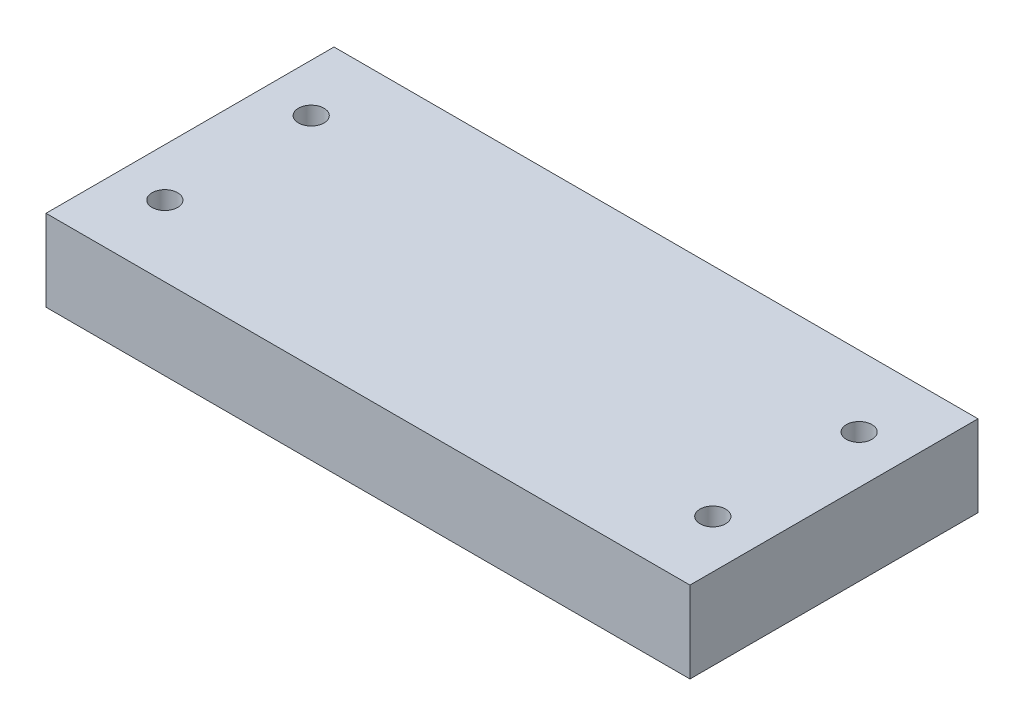
ISO-10303-21;
HEADER;
FILE_DESCRIPTION(('STEP AP214'),'2;1');
FILE_NAME('part.step','',(''),(''),'','','');
FILE_SCHEMA(('AUTOMOTIVE_DESIGN { 1 0 10303 214 1 1 1 1 }'));
ENDSEC;
DATA;
#1=APPLICATION_CONTEXT('core data for automotive mechanical design processes');
#2=APPLICATION_PROTOCOL_DEFINITION('international standard','automotive_design',2000,#1);
#3=PRODUCT_CONTEXT('',#1,'mechanical');
#4=PRODUCT('Part','Part','',(#3));
#5=PRODUCT_RELATED_PRODUCT_CATEGORY('part','',(#4));
#6=PRODUCT_DEFINITION_FORMATION('','',#4);
#7=PRODUCT_DEFINITION_CONTEXT('part definition',#1,'design');
#8=PRODUCT_DEFINITION('design','',#6,#7);
#9=PRODUCT_DEFINITION_SHAPE('','',#8);
#10=(LENGTH_UNIT() NAMED_UNIT(*) SI_UNIT(.MILLI.,.METRE.));
#11=(NAMED_UNIT(*) PLANE_ANGLE_UNIT() SI_UNIT($,.RADIAN.));
#12=(NAMED_UNIT(*) SI_UNIT($,.STERADIAN.) SOLID_ANGLE_UNIT());
#13=UNCERTAINTY_MEASURE_WITH_UNIT(LENGTH_MEASURE(1.E-05),#10,'distance_accuracy_value','');
#14=(GEOMETRIC_REPRESENTATION_CONTEXT(3) GLOBAL_UNCERTAINTY_ASSIGNED_CONTEXT((#13)) GLOBAL_UNIT_ASSIGNED_CONTEXT((#10,
#11,#12)) REPRESENTATION_CONTEXT('',''));
#15=CARTESIAN_POINT('',(0.,0.,0.));
#16=DIRECTION('',(0.,0.,1.));
#17=DIRECTION('',(1.,0.,0.));
#18=AXIS2_PLACEMENT_3D('',#15,#16,#17);
#19=CARTESIAN_POINT('',(59.436,0.,-15.875));
#20=DIRECTION('',(0.,1.,0.));
#21=DIRECTION('',(0.,0.,1.));
#22=AXIS2_PLACEMENT_3D('',#19,#20,#21);
#23=CYLINDRICAL_SURFACE('',#22,2.778125);
#24=CARTESIAN_POINT('',(59.436,0.,-15.875));
#25=DIRECTION('',(0.,1.,0.));
#26=DIRECTION('',(0.,0.,1.));
#27=AXIS2_PLACEMENT_3D('',#24,#25,#26);
#28=CIRCLE('',#27,2.778125);
#29=CARTESIAN_POINT('',(59.436,0.,-13.096875));
#30=VERTEX_POINT('',#29);
#31=EDGE_CURVE('E50',#30,#30,#28,.T.);
#32=CARTESIAN_POINT('',(59.436,17.653,-15.875));
#33=DIRECTION('',(0.,1.,0.));
#34=DIRECTION('',(0.,0.,1.));
#35=AXIS2_PLACEMENT_3D('',#32,#33,#34);
#36=CIRCLE('',#35,2.778125);
#37=CARTESIAN_POINT('',(59.436,17.653,-13.096875));
#38=VERTEX_POINT('',#37);
#39=EDGE_CURVE('E11',#38,#38,#36,.T.);
#40=CARTESIAN_POINT('',(59.436,0.,-13.096875));
#41=CARTESIAN_POINT('',(59.436,0.183885416666666,-13.096875));
#42=CARTESIAN_POINT('',(59.436,0.367770833333333,-13.096875));
#43=CARTESIAN_POINT('',(59.436,0.735541666666667,-13.096875));
#44=CARTESIAN_POINT('',(59.436,0.919427083333333,-13.096875));
#45=CARTESIAN_POINT('',(59.436,1.28719791666667,-13.096875));
#46=CARTESIAN_POINT('',(59.436,1.47108333333333,-13.096875));
#47=CARTESIAN_POINT('',(59.436,1.83885416666667,-13.096875));
#48=CARTESIAN_POINT('',(59.436,2.02273958333333,-13.096875));
#49=CARTESIAN_POINT('',(59.436,2.39051041666667,-13.096875));
#50=CARTESIAN_POINT('',(59.436,2.57439583333333,-13.096875));
#51=CARTESIAN_POINT('',(59.436,2.94216666666667,-13.096875));
#52=CARTESIAN_POINT('',(59.436,3.12605208333333,-13.096875));
#53=CARTESIAN_POINT('',(59.436,3.49382291666667,-13.096875));
#54=CARTESIAN_POINT('',(59.436,3.67770833333333,-13.096875));
#55=CARTESIAN_POINT('',(59.436,4.04547916666667,-13.096875));
#56=CARTESIAN_POINT('',(59.436,4.22936458333333,-13.096875));
#57=CARTESIAN_POINT('',(59.436,4.59713541666667,-13.096875));
#58=CARTESIAN_POINT('',(59.436,4.78102083333333,-13.096875));
#59=CARTESIAN_POINT('',(59.436,5.14879166666667,-13.096875));
#60=CARTESIAN_POINT('',(59.436,5.33267708333333,-13.096875));
#61=CARTESIAN_POINT('',(59.436,5.70044791666667,-13.096875));
#62=CARTESIAN_POINT('',(59.436,5.88433333333333,-13.096875));
#63=CARTESIAN_POINT('',(59.436,6.25210416666667,-13.096875));
#64=CARTESIAN_POINT('',(59.436,6.43598958333333,-13.096875));
#65=CARTESIAN_POINT('',(59.436,6.80376041666667,-13.096875));
#66=CARTESIAN_POINT('',(59.436,6.98764583333333,-13.096875));
#67=CARTESIAN_POINT('',(59.436,7.35541666666667,-13.096875));
#68=CARTESIAN_POINT('',(59.436,7.53930208333333,-13.096875));
#69=CARTESIAN_POINT('',(59.436,7.90707291666667,-13.096875));
#70=CARTESIAN_POINT('',(59.436,8.09095833333333,-13.096875));
#71=CARTESIAN_POINT('',(59.436,8.45872916666666,-13.096875));
#72=CARTESIAN_POINT('',(59.436,8.64261458333333,-13.096875));
#73=CARTESIAN_POINT('',(59.436,9.01038541666667,-13.096875));
#74=CARTESIAN_POINT('',(59.436,9.19427083333333,-13.096875));
#75=CARTESIAN_POINT('',(59.436,9.56204166666667,-13.096875));
#76=CARTESIAN_POINT('',(59.436,9.74592708333333,-13.096875));
#77=CARTESIAN_POINT('',(59.436,10.1136979166667,-13.096875));
#78=CARTESIAN_POINT('',(59.436,10.2975833333333,-13.096875));
#79=CARTESIAN_POINT('',(59.436,10.6653541666667,-13.096875));
#80=CARTESIAN_POINT('',(59.436,10.8492395833333,-13.096875));
#81=CARTESIAN_POINT('',(59.436,11.2170104166667,-13.096875));
#82=CARTESIAN_POINT('',(59.436,11.4008958333333,-13.096875));
#83=CARTESIAN_POINT('',(59.436,11.7686666666667,-13.096875));
#84=CARTESIAN_POINT('',(59.436,11.9525520833333,-13.096875));
#85=CARTESIAN_POINT('',(59.436,12.3203229166667,-13.096875));
#86=CARTESIAN_POINT('',(59.436,12.5042083333333,-13.096875));
#87=CARTESIAN_POINT('',(59.436,12.8719791666667,-13.096875));
#88=CARTESIAN_POINT('',(59.436,13.0558645833333,-13.096875));
#89=CARTESIAN_POINT('',(59.436,13.4236354166667,-13.096875));
#90=CARTESIAN_POINT('',(59.436,13.6075208333333,-13.096875));
#91=CARTESIAN_POINT('',(59.436,13.9752916666667,-13.096875));
#92=CARTESIAN_POINT('',(59.436,14.1591770833333,-13.096875));
#93=CARTESIAN_POINT('',(59.436,14.5269479166667,-13.096875));
#94=CARTESIAN_POINT('',(59.436,14.7108333333333,-13.096875));
#95=CARTESIAN_POINT('',(59.436,15.0786041666667,-13.096875));
#96=CARTESIAN_POINT('',(59.436,15.2624895833333,-13.096875));
#97=CARTESIAN_POINT('',(59.436,15.6302604166667,-13.096875));
#98=CARTESIAN_POINT('',(59.436,15.8141458333333,-13.096875));
#99=CARTESIAN_POINT('',(59.436,16.1819166666667,-13.096875));
#100=CARTESIAN_POINT('',(59.436,16.3658020833333,-13.096875));
#101=CARTESIAN_POINT('',(59.436,16.7335729166667,-13.096875));
#102=CARTESIAN_POINT('',(59.436,16.9174583333333,-13.096875));
#103=CARTESIAN_POINT('',(59.436,17.2852291666667,-13.096875));
#104=CARTESIAN_POINT('',(59.436,17.4691145833333,-13.096875));
#105=CARTESIAN_POINT('',(59.436,17.653,-13.096875));
#106=B_SPLINE_CURVE_WITH_KNOTS('',3,(#40,#41,#42,#43,#44,#45,#46,#47,#48,#49,#50,#51,#52,#53,
#54,#55,#56,#57,#58,#59,#60,#61,#62,#63,#64,#65,#66,#67,#68,#69,#70,#71,#72,#73,#74,#75,#76,#77,
#78,#79,#80,#81,#82,#83,#84,#85,#86,#87,#88,#89,#90,#91,#92,#93,#94,#95,#96,#97,#98,#99,#100,
#101,#102,#103,#104,#105),.UNSPECIFIED.,.F.,.F.,(4,2,2,2,2,2,2,2,2,2,2,2,2,2,2,2,2,2,2,2,2,2,2,
2,2,2,2,2,2,2,2,2,4),(0.,0.55165625,1.1033125,1.65496875,2.206625,2.75828125,3.3099375,
3.86159375,4.41325,4.96490625,5.5165625,6.06821875,6.619875,7.17153125,7.7231875,8.27484375,
8.8265,9.37815625,9.9298125,10.48146875,11.033125,11.58478125,12.1364375,12.68809375,13.23975,
13.79140625,14.3430625,14.89471875,15.446375,15.99803125,16.5496875,17.10134375,17.653),.UNSPECIFIED.);
#107=EDGE_CURVE('BSEAM42',#30,#38,#106,.T.);
#108=ORIENTED_EDGE('',*,*,#31,.F.);
#109=ORIENTED_EDGE('',*,*,#39,.T.);
#110=ORIENTED_EDGE('',*,*,#107,.T.);
#111=ORIENTED_EDGE('',*,*,#107,.F.);
#112=EDGE_LOOP('',(#108,#110,#109,#111));
#113=FACE_BOUND('',#112,.T.);
#114=ADVANCED_FACE('F42',(#113),#23,.F.);
#115=CARTESIAN_POINT('',(59.436,0.,15.875));
#116=DIRECTION('',(0.,1.,0.));
#117=DIRECTION('',(0.,0.,1.));
#118=AXIS2_PLACEMENT_3D('',#115,#116,#117);
#119=CYLINDRICAL_SURFACE('',#118,2.778125);
#120=CARTESIAN_POINT('',(59.436,0.,15.875));
#121=DIRECTION('',(0.,1.,0.));
#122=DIRECTION('',(0.,0.,1.));
#123=AXIS2_PLACEMENT_3D('',#120,#121,#122);
#124=CIRCLE('',#123,2.778125);
#125=CARTESIAN_POINT('',(59.436,0.,18.653125));
#126=VERTEX_POINT('',#125);
#127=EDGE_CURVE('E120',#126,#126,#124,.T.);
#128=CARTESIAN_POINT('',(59.436,17.653,15.875));
#129=DIRECTION('',(0.,1.,0.));
#130=DIRECTION('',(0.,0.,1.));
#131=AXIS2_PLACEMENT_3D('',#128,#129,#130);
#132=CIRCLE('',#131,2.778125);
#133=CARTESIAN_POINT('',(59.436,17.653,18.653125));
#134=VERTEX_POINT('',#133);
#135=EDGE_CURVE('E123',#134,#134,#132,.T.);
#136=CARTESIAN_POINT('',(59.436,0.,18.653125));
#137=CARTESIAN_POINT('',(59.436,0.183885416666666,18.653125));
#138=CARTESIAN_POINT('',(59.436,0.367770833333333,18.653125));
#139=CARTESIAN_POINT('',(59.436,0.735541666666667,18.653125));
#140=CARTESIAN_POINT('',(59.436,0.919427083333333,18.653125));
#141=CARTESIAN_POINT('',(59.436,1.28719791666667,18.653125));
#142=CARTESIAN_POINT('',(59.436,1.47108333333333,18.653125));
#143=CARTESIAN_POINT('',(59.436,1.83885416666667,18.653125));
#144=CARTESIAN_POINT('',(59.436,2.02273958333333,18.653125));
#145=CARTESIAN_POINT('',(59.436,2.39051041666667,18.653125));
#146=CARTESIAN_POINT('',(59.436,2.57439583333333,18.653125));
#147=CARTESIAN_POINT('',(59.436,2.94216666666667,18.653125));
#148=CARTESIAN_POINT('',(59.436,3.12605208333333,18.653125));
#149=CARTESIAN_POINT('',(59.436,3.49382291666667,18.653125));
#150=CARTESIAN_POINT('',(59.436,3.67770833333333,18.653125));
#151=CARTESIAN_POINT('',(59.436,4.04547916666667,18.653125));
#152=CARTESIAN_POINT('',(59.436,4.22936458333333,18.653125));
#153=CARTESIAN_POINT('',(59.436,4.59713541666667,18.653125));
#154=CARTESIAN_POINT('',(59.436,4.78102083333333,18.653125));
#155=CARTESIAN_POINT('',(59.436,5.14879166666667,18.653125));
#156=CARTESIAN_POINT('',(59.436,5.33267708333333,18.653125));
#157=CARTESIAN_POINT('',(59.436,5.70044791666667,18.653125));
#158=CARTESIAN_POINT('',(59.436,5.88433333333333,18.653125));
#159=CARTESIAN_POINT('',(59.436,6.25210416666667,18.653125));
#160=CARTESIAN_POINT('',(59.436,6.43598958333333,18.653125));
#161=CARTESIAN_POINT('',(59.436,6.80376041666667,18.653125));
#162=CARTESIAN_POINT('',(59.436,6.98764583333333,18.653125));
#163=CARTESIAN_POINT('',(59.436,7.35541666666667,18.653125));
#164=CARTESIAN_POINT('',(59.436,7.53930208333333,18.653125));
#165=CARTESIAN_POINT('',(59.436,7.90707291666667,18.653125));
#166=CARTESIAN_POINT('',(59.436,8.09095833333333,18.653125));
#167=CARTESIAN_POINT('',(59.436,8.45872916666666,18.653125));
#168=CARTESIAN_POINT('',(59.436,8.64261458333333,18.653125));
#169=CARTESIAN_POINT('',(59.436,9.01038541666667,18.653125));
#170=CARTESIAN_POINT('',(59.436,9.19427083333333,18.653125));
#171=CARTESIAN_POINT('',(59.436,9.56204166666667,18.653125));
#172=CARTESIAN_POINT('',(59.436,9.74592708333333,18.653125));
#173=CARTESIAN_POINT('',(59.436,10.1136979166667,18.653125));
#174=CARTESIAN_POINT('',(59.436,10.2975833333333,18.653125));
#175=CARTESIAN_POINT('',(59.436,10.6653541666667,18.653125));
#176=CARTESIAN_POINT('',(59.436,10.8492395833333,18.653125));
#177=CARTESIAN_POINT('',(59.436,11.2170104166667,18.653125));
#178=CARTESIAN_POINT('',(59.436,11.4008958333333,18.653125));
#179=CARTESIAN_POINT('',(59.436,11.7686666666667,18.653125));
#180=CARTESIAN_POINT('',(59.436,11.9525520833333,18.653125));
#181=CARTESIAN_POINT('',(59.436,12.3203229166667,18.653125));
#182=CARTESIAN_POINT('',(59.436,12.5042083333333,18.653125));
#183=CARTESIAN_POINT('',(59.436,12.8719791666667,18.653125));
#184=CARTESIAN_POINT('',(59.436,13.0558645833333,18.653125));
#185=CARTESIAN_POINT('',(59.436,13.4236354166667,18.653125));
#186=CARTESIAN_POINT('',(59.436,13.6075208333333,18.653125));
#187=CARTESIAN_POINT('',(59.436,13.9752916666667,18.653125));
#188=CARTESIAN_POINT('',(59.436,14.1591770833333,18.653125));
#189=CARTESIAN_POINT('',(59.436,14.5269479166667,18.653125));
#190=CARTESIAN_POINT('',(59.436,14.7108333333333,18.653125));
#191=CARTESIAN_POINT('',(59.436,15.0786041666667,18.653125));
#192=CARTESIAN_POINT('',(59.436,15.2624895833333,18.653125));
#193=CARTESIAN_POINT('',(59.436,15.6302604166667,18.653125));
#194=CARTESIAN_POINT('',(59.436,15.8141458333333,18.653125));
#195=CARTESIAN_POINT('',(59.436,16.1819166666667,18.653125));
#196=CARTESIAN_POINT('',(59.436,16.3658020833333,18.653125));
#197=CARTESIAN_POINT('',(59.436,16.7335729166667,18.653125));
#198=CARTESIAN_POINT('',(59.436,16.9174583333333,18.653125));
#199=CARTESIAN_POINT('',(59.436,17.2852291666667,18.653125));
#200=CARTESIAN_POINT('',(59.436,17.4691145833333,18.653125));
#201=CARTESIAN_POINT('',(59.436,17.653,18.653125));
#202=B_SPLINE_CURVE_WITH_KNOTS('',3,(#136,#137,#138,#139,#140,#141,#142,#143,#144,#145,#146,
#147,#148,#149,#150,#151,#152,#153,#154,#155,#156,#157,#158,#159,#160,#161,#162,#163,#164,#165,
#166,#167,#168,#169,#170,#171,#172,#173,#174,#175,#176,#177,#178,#179,#180,#181,#182,#183,#184,
#185,#186,#187,#188,#189,#190,#191,#192,#193,#194,#195,#196,#197,#198,#199,#200,#201),
.UNSPECIFIED.,.F.,.F.,(4,2,2,2,2,2,2,2,2,2,2,2,2,2,2,2,2,2,2,2,2,2,2,2,2,2,2,2,2,2,2,2,4),(0.,
0.55165625,1.1033125,1.65496875,2.206625,2.75828125,3.3099375,3.86159375,4.41325,4.96490625,
5.5165625,6.06821875,6.619875,7.17153125,7.7231875,8.27484375,8.8265,9.37815625,9.9298125,
10.48146875,11.033125,11.58478125,12.1364375,12.68809375,13.23975,13.79140625,14.3430625,
14.89471875,15.446375,15.99803125,16.5496875,17.10134375,17.653),.UNSPECIFIED.);
#203=EDGE_CURVE('BSEAM132',#126,#134,#202,.T.);
#204=ORIENTED_EDGE('',*,*,#127,.F.);
#205=ORIENTED_EDGE('',*,*,#135,.T.);
#206=ORIENTED_EDGE('',*,*,#203,.T.);
#207=ORIENTED_EDGE('',*,*,#203,.F.);
#208=EDGE_LOOP('',(#204,#206,#205,#207));
#209=FACE_BOUND('',#208,.T.);
#210=ADVANCED_FACE('F132',(#209),#119,.F.);
#211=CARTESIAN_POINT('',(69.85,17.653,31.242));
#212=DIRECTION('',(-1.,0.,0.));
#213=DIRECTION('',(0.,0.,1.));
#214=AXIS2_PLACEMENT_3D('',#211,#212,#213);
#215=PLANE('',#214);
#216=DIRECTION('',(0.,0.,-1.));
#217=VECTOR('',#216,1.);
#218=CARTESIAN_POINT('',(69.85,0.,31.242));
#219=LINE('',#218,#217);
#220=CARTESIAN_POINT('',(69.85,0.,31.242));
#221=VERTEX_POINT('',#220);
#222=CARTESIAN_POINT('',(69.85,0.,-31.242));
#223=VERTEX_POINT('',#222);
#224=EDGE_CURVE('E110',#221,#223,#219,.T.);
#225=ORIENTED_EDGE('',*,*,#224,.T.);
#226=DIRECTION('',(0.,-1.,0.));
#227=VECTOR('',#226,1.);
#228=CARTESIAN_POINT('',(69.85,17.653,-31.242));
#229=LINE('',#228,#227);
#230=CARTESIAN_POINT('',(69.85,17.653,-31.242));
#231=VERTEX_POINT('',#230);
#232=EDGE_CURVE('E101',#231,#223,#229,.T.);
#233=ORIENTED_EDGE('',*,*,#232,.F.);
#234=DIRECTION('',(0.,0.,-1.));
#235=VECTOR('',#234,1.);
#236=CARTESIAN_POINT('',(69.85,17.653,31.242));
#237=LINE('',#236,#235);
#238=CARTESIAN_POINT('',(69.85,17.653,31.242));
#239=VERTEX_POINT('',#238);
#240=EDGE_CURVE('E95',#239,#231,#237,.T.);
#241=ORIENTED_EDGE('',*,*,#240,.F.);
#242=DIRECTION('',(0.,-1.,0.));
#243=VECTOR('',#242,1.);
#244=CARTESIAN_POINT('',(69.85,17.653,31.242));
#245=LINE('',#244,#243);
#246=EDGE_CURVE('E106',#239,#221,#245,.T.);
#247=ORIENTED_EDGE('',*,*,#246,.T.);
#248=EDGE_LOOP('',(#225,#233,#241,#247));
#249=FACE_BOUND('',#248,.T.);
#250=ADVANCED_FACE('F157',(#249),#215,.F.);
#251=CARTESIAN_POINT('',(-69.85,17.653,-31.242));
#252=DIRECTION('',(0.,0.,1.));
#253=DIRECTION('',(1.,0.,0.));
#254=AXIS2_PLACEMENT_3D('',#251,#252,#253);
#255=PLANE('',#254);
#256=DIRECTION('',(-1.,0.,0.));
#257=VECTOR('',#256,1.);
#258=CARTESIAN_POINT('',(-69.85,0.,-31.242));
#259=LINE('',#258,#257);
#260=CARTESIAN_POINT('',(-69.85,0.,-31.242));
#261=VERTEX_POINT('',#260);
#262=EDGE_CURVE('E100',#223,#261,#259,.T.);
#263=ORIENTED_EDGE('',*,*,#262,.T.);
#264=DIRECTION('',(0.,-1.,0.));
#265=VECTOR('',#264,1.);
#266=CARTESIAN_POINT('',(-69.85,17.653,-31.242));
#267=LINE('',#266,#265);
#268=CARTESIAN_POINT('',(-69.85,17.653,-31.242));
#269=VERTEX_POINT('',#268);
#270=EDGE_CURVE('E98',#269,#261,#267,.T.);
#271=ORIENTED_EDGE('',*,*,#270,.F.);
#272=DIRECTION('',(-1.,0.,0.));
#273=VECTOR('',#272,1.);
#274=CARTESIAN_POINT('',(-69.85,17.653,-31.242));
#275=LINE('',#274,#273);
#276=EDGE_CURVE('E89',#231,#269,#275,.T.);
#277=ORIENTED_EDGE('',*,*,#276,.F.);
#278=ORIENTED_EDGE('',*,*,#232,.T.);
#279=EDGE_LOOP('',(#263,#271,#277,#278));
#280=FACE_BOUND('',#279,.T.);
#281=ADVANCED_FACE('F99',(#280),#255,.F.);
#282=CARTESIAN_POINT('',(-69.85,17.653,31.242));
#283=DIRECTION('',(1.,0.,0.));
#284=DIRECTION('',(0.,0.,-1.));
#285=AXIS2_PLACEMENT_3D('',#282,#283,#284);
#286=PLANE('',#285);
#287=DIRECTION('',(0.,0.,1.));
#288=VECTOR('',#287,1.);
#289=CARTESIAN_POINT('',(-69.85,0.,31.242));
#290=LINE('',#289,#288);
#291=CARTESIAN_POINT('',(-69.85,0.,31.242));
#292=VERTEX_POINT('',#291);
#293=EDGE_CURVE('E75',#261,#292,#290,.T.);
#294=ORIENTED_EDGE('',*,*,#293,.T.);
#295=DIRECTION('',(0.,-1.,0.));
#296=VECTOR('',#295,1.);
#297=CARTESIAN_POINT('',(-69.85,17.653,31.242));
#298=LINE('',#297,#296);
#299=CARTESIAN_POINT('',(-69.85,17.653,31.242));
#300=VERTEX_POINT('',#299);
#301=EDGE_CURVE('E102',#300,#292,#298,.T.);
#302=ORIENTED_EDGE('',*,*,#301,.F.);
#303=DIRECTION('',(0.,0.,1.));
#304=VECTOR('',#303,1.);
#305=CARTESIAN_POINT('',(-69.85,17.653,31.242));
#306=LINE('',#305,#304);
#307=EDGE_CURVE('E93',#269,#300,#306,.T.);
#308=ORIENTED_EDGE('',*,*,#307,.F.);
#309=ORIENTED_EDGE('',*,*,#270,.T.);
#310=EDGE_LOOP('',(#294,#302,#308,#309));
#311=FACE_BOUND('',#310,.T.);
#312=ADVANCED_FACE('F104',(#311),#286,.F.);
#313=CARTESIAN_POINT('',(-69.85,17.653,31.242));
#314=DIRECTION('',(0.,0.,-1.));
#315=DIRECTION('',(-1.,0.,0.));
#316=AXIS2_PLACEMENT_3D('',#313,#314,#315);
#317=PLANE('',#316);
#318=DIRECTION('',(1.,0.,0.));
#319=VECTOR('',#318,1.);
#320=CARTESIAN_POINT('',(-69.85,0.,31.242));
#321=LINE('',#320,#319);
#322=EDGE_CURVE('E81',#292,#221,#321,.T.);
#323=ORIENTED_EDGE('',*,*,#322,.T.);
#324=ORIENTED_EDGE('',*,*,#246,.F.);
#325=DIRECTION('',(1.,0.,0.));
#326=VECTOR('',#325,1.);
#327=CARTESIAN_POINT('',(-69.85,17.653,31.242));
#328=LINE('',#327,#326);
#329=EDGE_CURVE('E58',#300,#239,#328,.T.);
#330=ORIENTED_EDGE('',*,*,#329,.F.);
#331=ORIENTED_EDGE('',*,*,#301,.T.);
#332=EDGE_LOOP('',(#323,#324,#330,#331));
#333=FACE_BOUND('',#332,.T.);
#334=ADVANCED_FACE('F136',(#333),#317,.F.);
#335=CARTESIAN_POINT('',(0.,17.653,0.));
#336=DIRECTION('',(0.,-1.,0.));
#337=DIRECTION('',(0.,0.,-1.));
#338=AXIS2_PLACEMENT_3D('',#335,#336,#337);
#339=PLANE('',#338);
#340=CARTESIAN_POINT('',(-59.436,17.653,-15.875));
#341=DIRECTION('',(0.,1.,0.));
#342=DIRECTION('',(0.,0.,1.));
#343=AXIS2_PLACEMENT_3D('',#340,#341,#342);
#344=CIRCLE('',#343,2.778125);
#345=CARTESIAN_POINT('',(-59.436,17.653,-13.096875));
#346=VERTEX_POINT('',#345);
#347=EDGE_CURVE('E233',#346,#346,#344,.T.);
#348=ORIENTED_EDGE('',*,*,#347,.F.);
#349=EDGE_LOOP('',(#348));
#350=FACE_BOUND('',#349,.T.);
#351=CARTESIAN_POINT('',(-59.436,17.653,15.875));
#352=DIRECTION('',(0.,1.,0.));
#353=DIRECTION('',(0.,0.,1.));
#354=AXIS2_PLACEMENT_3D('',#351,#352,#353);
#355=CIRCLE('',#354,2.778125);
#356=CARTESIAN_POINT('',(-59.436,17.653,18.653125));
#357=VERTEX_POINT('',#356);
#358=EDGE_CURVE('E234',#357,#357,#355,.T.);
#359=ORIENTED_EDGE('',*,*,#358,.F.);
#360=EDGE_LOOP('',(#359));
#361=FACE_BOUND('',#360,.T.);
#362=ORIENTED_EDGE('',*,*,#240,.T.);
#363=ORIENTED_EDGE('',*,*,#276,.T.);
#364=ORIENTED_EDGE('',*,*,#307,.T.);
#365=ORIENTED_EDGE('',*,*,#329,.T.);
#366=EDGE_LOOP('',(#362,#363,#364,#365));
#367=FACE_BOUND('',#366,.T.);
#368=ORIENTED_EDGE('',*,*,#135,.F.);
#369=EDGE_LOOP('',(#368));
#370=FACE_BOUND('',#369,.T.);
#371=ORIENTED_EDGE('',*,*,#39,.F.);
#372=EDGE_LOOP('',(#371));
#373=FACE_BOUND('',#372,.T.);
#374=ADVANCED_FACE('F90',(#350,#361,#367,#370,#373),#339,.F.);
#375=CARTESIAN_POINT('',(0.,0.,0.));
#376=DIRECTION('',(0.,-1.,0.));
#377=DIRECTION('',(0.,0.,-1.));
#378=AXIS2_PLACEMENT_3D('',#375,#376,#377);
#379=PLANE('',#378);
#380=CARTESIAN_POINT('',(-59.436,0.,-15.875));
#381=DIRECTION('',(0.,1.,0.));
#382=DIRECTION('',(0.,0.,1.));
#383=AXIS2_PLACEMENT_3D('',#380,#381,#382);
#384=CIRCLE('',#383,2.778125);
#385=CARTESIAN_POINT('',(-59.436,0.,-13.096875));
#386=VERTEX_POINT('',#385);
#387=EDGE_CURVE('E231',#386,#386,#384,.T.);
#388=ORIENTED_EDGE('',*,*,#387,.T.);
#389=EDGE_LOOP('',(#388));
#390=FACE_BOUND('',#389,.T.);
#391=CARTESIAN_POINT('',(-59.436,0.,15.875));
#392=DIRECTION('',(0.,1.,0.));
#393=DIRECTION('',(0.,0.,1.));
#394=AXIS2_PLACEMENT_3D('',#391,#392,#393);
#395=CIRCLE('',#394,2.778125);
#396=CARTESIAN_POINT('',(-59.436,0.,18.653125));
#397=VERTEX_POINT('',#396);
#398=EDGE_CURVE('E113',#397,#397,#395,.T.);
#399=ORIENTED_EDGE('',*,*,#398,.T.);
#400=EDGE_LOOP('',(#399));
#401=FACE_BOUND('',#400,.T.);
#402=ORIENTED_EDGE('',*,*,#224,.F.);
#403=ORIENTED_EDGE('',*,*,#322,.F.);
#404=ORIENTED_EDGE('',*,*,#293,.F.);
#405=ORIENTED_EDGE('',*,*,#262,.F.);
#406=EDGE_LOOP('',(#402,#403,#404,#405));
#407=FACE_BOUND('',#406,.T.);
#408=ORIENTED_EDGE('',*,*,#127,.T.);
#409=EDGE_LOOP('',(#408));
#410=FACE_BOUND('',#409,.T.);
#411=ORIENTED_EDGE('',*,*,#31,.T.);
#412=EDGE_LOOP('',(#411));
#413=FACE_BOUND('',#412,.T.);
#414=ADVANCED_FACE('F128',(#390,#401,#407,#410,#413),#379,.T.);
#415=CARTESIAN_POINT('',(-59.436,0.,15.875));
#416=DIRECTION('',(0.,1.,0.));
#417=DIRECTION('',(0.,0.,1.));
#418=AXIS2_PLACEMENT_3D('',#415,#416,#417);
#419=CYLINDRICAL_SURFACE('',#418,2.778125);
#420=CARTESIAN_POINT('',(-59.436,0.,18.653125));
#421=CARTESIAN_POINT('',(-59.436,0.183885416666666,18.653125));
#422=CARTESIAN_POINT('',(-59.436,0.367770833333333,18.653125));
#423=CARTESIAN_POINT('',(-59.436,0.735541666666667,18.653125));
#424=CARTESIAN_POINT('',(-59.436,0.919427083333333,18.653125));
#425=CARTESIAN_POINT('',(-59.436,1.28719791666667,18.653125));
#426=CARTESIAN_POINT('',(-59.436,1.47108333333333,18.653125));
#427=CARTESIAN_POINT('',(-59.436,1.83885416666667,18.653125));
#428=CARTESIAN_POINT('',(-59.436,2.02273958333333,18.653125));
#429=CARTESIAN_POINT('',(-59.436,2.39051041666667,18.653125));
#430=CARTESIAN_POINT('',(-59.436,2.57439583333333,18.653125));
#431=CARTESIAN_POINT('',(-59.436,2.94216666666667,18.653125));
#432=CARTESIAN_POINT('',(-59.436,3.12605208333333,18.653125));
#433=CARTESIAN_POINT('',(-59.436,3.49382291666667,18.653125));
#434=CARTESIAN_POINT('',(-59.436,3.67770833333333,18.653125));
#435=CARTESIAN_POINT('',(-59.436,4.04547916666667,18.653125));
#436=CARTESIAN_POINT('',(-59.436,4.22936458333333,18.653125));
#437=CARTESIAN_POINT('',(-59.436,4.59713541666667,18.653125));
#438=CARTESIAN_POINT('',(-59.436,4.78102083333333,18.653125));
#439=CARTESIAN_POINT('',(-59.436,5.14879166666667,18.653125));
#440=CARTESIAN_POINT('',(-59.436,5.33267708333333,18.653125));
#441=CARTESIAN_POINT('',(-59.436,5.70044791666667,18.653125));
#442=CARTESIAN_POINT('',(-59.436,5.88433333333333,18.653125));
#443=CARTESIAN_POINT('',(-59.436,6.25210416666667,18.653125));
#444=CARTESIAN_POINT('',(-59.436,6.43598958333333,18.653125));
#445=CARTESIAN_POINT('',(-59.436,6.80376041666667,18.653125));
#446=CARTESIAN_POINT('',(-59.436,6.98764583333333,18.653125));
#447=CARTESIAN_POINT('',(-59.436,7.35541666666667,18.653125));
#448=CARTESIAN_POINT('',(-59.436,7.53930208333333,18.653125));
#449=CARTESIAN_POINT('',(-59.436,7.90707291666667,18.653125));
#450=CARTESIAN_POINT('',(-59.436,8.09095833333333,18.653125));
#451=CARTESIAN_POINT('',(-59.436,8.45872916666666,18.653125));
#452=CARTESIAN_POINT('',(-59.436,8.64261458333333,18.653125));
#453=CARTESIAN_POINT('',(-59.436,9.01038541666667,18.653125));
#454=CARTESIAN_POINT('',(-59.436,9.19427083333333,18.653125));
#455=CARTESIAN_POINT('',(-59.436,9.56204166666667,18.653125));
#456=CARTESIAN_POINT('',(-59.436,9.74592708333333,18.653125));
#457=CARTESIAN_POINT('',(-59.436,10.1136979166667,18.653125));
#458=CARTESIAN_POINT('',(-59.436,10.2975833333333,18.653125));
#459=CARTESIAN_POINT('',(-59.436,10.6653541666667,18.653125));
#460=CARTESIAN_POINT('',(-59.436,10.8492395833333,18.653125));
#461=CARTESIAN_POINT('',(-59.436,11.2170104166667,18.653125));
#462=CARTESIAN_POINT('',(-59.436,11.4008958333333,18.653125));
#463=CARTESIAN_POINT('',(-59.436,11.7686666666667,18.653125));
#464=CARTESIAN_POINT('',(-59.436,11.9525520833333,18.653125));
#465=CARTESIAN_POINT('',(-59.436,12.3203229166667,18.653125));
#466=CARTESIAN_POINT('',(-59.436,12.5042083333333,18.653125));
#467=CARTESIAN_POINT('',(-59.436,12.8719791666667,18.653125));
#468=CARTESIAN_POINT('',(-59.436,13.0558645833333,18.653125));
#469=CARTESIAN_POINT('',(-59.436,13.4236354166667,18.653125));
#470=CARTESIAN_POINT('',(-59.436,13.6075208333333,18.653125));
#471=CARTESIAN_POINT('',(-59.436,13.9752916666667,18.653125));
#472=CARTESIAN_POINT('',(-59.436,14.1591770833333,18.653125));
#473=CARTESIAN_POINT('',(-59.436,14.5269479166667,18.653125));
#474=CARTESIAN_POINT('',(-59.436,14.7108333333333,18.653125));
#475=CARTESIAN_POINT('',(-59.436,15.0786041666667,18.653125));
#476=CARTESIAN_POINT('',(-59.436,15.2624895833333,18.653125));
#477=CARTESIAN_POINT('',(-59.436,15.6302604166667,18.653125));
#478=CARTESIAN_POINT('',(-59.436,15.8141458333333,18.653125));
#479=CARTESIAN_POINT('',(-59.436,16.1819166666667,18.653125));
#480=CARTESIAN_POINT('',(-59.436,16.3658020833333,18.653125));
#481=CARTESIAN_POINT('',(-59.436,16.7335729166667,18.653125));
#482=CARTESIAN_POINT('',(-59.436,16.9174583333333,18.653125));
#483=CARTESIAN_POINT('',(-59.436,17.2852291666667,18.653125));
#484=CARTESIAN_POINT('',(-59.436,17.4691145833333,18.653125));
#485=CARTESIAN_POINT('',(-59.436,17.653,18.653125));
#486=B_SPLINE_CURVE_WITH_KNOTS('',3,(#420,#421,#422,#423,#424,#425,#426,#427,#428,#429,#430,
#431,#432,#433,#434,#435,#436,#437,#438,#439,#440,#441,#442,#443,#444,#445,#446,#447,#448,#449,
#450,#451,#452,#453,#454,#455,#456,#457,#458,#459,#460,#461,#462,#463,#464,#465,#466,#467,#468,
#469,#470,#471,#472,#473,#474,#475,#476,#477,#478,#479,#480,#481,#482,#483,#484,#485),
.UNSPECIFIED.,.F.,.F.,(4,2,2,2,2,2,2,2,2,2,2,2,2,2,2,2,2,2,2,2,2,2,2,2,2,2,2,2,2,2,2,2,4),(0.,
0.55165625,1.1033125,1.65496875,2.206625,2.75828125,3.3099375,3.86159375,4.41325,4.96490625,
5.5165625,6.06821875,6.619875,7.17153125,7.7231875,8.27484375,8.8265,9.37815625,9.9298125,
10.48146875,11.033125,11.58478125,12.1364375,12.68809375,13.23975,13.79140625,14.3430625,
14.89471875,15.446375,15.99803125,16.5496875,17.10134375,17.653),.UNSPECIFIED.);
#487=EDGE_CURVE('BSEAM143',#397,#357,#486,.T.);
#488=ORIENTED_EDGE('',*,*,#398,.F.);
#489=ORIENTED_EDGE('',*,*,#358,.T.);
#490=ORIENTED_EDGE('',*,*,#487,.T.);
#491=ORIENTED_EDGE('',*,*,#487,.F.);
#492=EDGE_LOOP('',(#488,#490,#489,#491));
#493=FACE_BOUND('',#492,.T.);
#494=ADVANCED_FACE('F143',(#493),#419,.F.);
#495=CARTESIAN_POINT('',(-59.436,0.,-15.875));
#496=DIRECTION('',(0.,1.,0.));
#497=DIRECTION('',(0.,0.,1.));
#498=AXIS2_PLACEMENT_3D('',#495,#496,#497);
#499=CYLINDRICAL_SURFACE('',#498,2.778125);
#500=CARTESIAN_POINT('',(-59.436,0.,-13.096875));
#501=CARTESIAN_POINT('',(-59.436,0.183885416666666,-13.096875));
#502=CARTESIAN_POINT('',(-59.436,0.367770833333333,-13.096875));
#503=CARTESIAN_POINT('',(-59.436,0.735541666666667,-13.096875));
#504=CARTESIAN_POINT('',(-59.436,0.919427083333333,-13.096875));
#505=CARTESIAN_POINT('',(-59.436,1.28719791666667,-13.096875));
#506=CARTESIAN_POINT('',(-59.436,1.47108333333333,-13.096875));
#507=CARTESIAN_POINT('',(-59.436,1.83885416666667,-13.096875));
#508=CARTESIAN_POINT('',(-59.436,2.02273958333333,-13.096875));
#509=CARTESIAN_POINT('',(-59.436,2.39051041666667,-13.096875));
#510=CARTESIAN_POINT('',(-59.436,2.57439583333333,-13.096875));
#511=CARTESIAN_POINT('',(-59.436,2.94216666666667,-13.096875));
#512=CARTESIAN_POINT('',(-59.436,3.12605208333333,-13.096875));
#513=CARTESIAN_POINT('',(-59.436,3.49382291666667,-13.096875));
#514=CARTESIAN_POINT('',(-59.436,3.67770833333333,-13.096875));
#515=CARTESIAN_POINT('',(-59.436,4.04547916666667,-13.096875));
#516=CARTESIAN_POINT('',(-59.436,4.22936458333333,-13.096875));
#517=CARTESIAN_POINT('',(-59.436,4.59713541666667,-13.096875));
#518=CARTESIAN_POINT('',(-59.436,4.78102083333333,-13.096875));
#519=CARTESIAN_POINT('',(-59.436,5.14879166666667,-13.096875));
#520=CARTESIAN_POINT('',(-59.436,5.33267708333333,-13.096875));
#521=CARTESIAN_POINT('',(-59.436,5.70044791666667,-13.096875));
#522=CARTESIAN_POINT('',(-59.436,5.88433333333333,-13.096875));
#523=CARTESIAN_POINT('',(-59.436,6.25210416666667,-13.096875));
#524=CARTESIAN_POINT('',(-59.436,6.43598958333333,-13.096875));
#525=CARTESIAN_POINT('',(-59.436,6.80376041666667,-13.096875));
#526=CARTESIAN_POINT('',(-59.436,6.98764583333333,-13.096875));
#527=CARTESIAN_POINT('',(-59.436,7.35541666666667,-13.096875));
#528=CARTESIAN_POINT('',(-59.436,7.53930208333333,-13.096875));
#529=CARTESIAN_POINT('',(-59.436,7.90707291666667,-13.096875));
#530=CARTESIAN_POINT('',(-59.436,8.09095833333333,-13.096875));
#531=CARTESIAN_POINT('',(-59.436,8.45872916666666,-13.096875));
#532=CARTESIAN_POINT('',(-59.436,8.64261458333333,-13.096875));
#533=CARTESIAN_POINT('',(-59.436,9.01038541666667,-13.096875));
#534=CARTESIAN_POINT('',(-59.436,9.19427083333333,-13.096875));
#535=CARTESIAN_POINT('',(-59.436,9.56204166666667,-13.096875));
#536=CARTESIAN_POINT('',(-59.436,9.74592708333333,-13.096875));
#537=CARTESIAN_POINT('',(-59.436,10.1136979166667,-13.096875));
#538=CARTESIAN_POINT('',(-59.436,10.2975833333333,-13.096875));
#539=CARTESIAN_POINT('',(-59.436,10.6653541666667,-13.096875));
#540=CARTESIAN_POINT('',(-59.436,10.8492395833333,-13.096875));
#541=CARTESIAN_POINT('',(-59.436,11.2170104166667,-13.096875));
#542=CARTESIAN_POINT('',(-59.436,11.4008958333333,-13.096875));
#543=CARTESIAN_POINT('',(-59.436,11.7686666666667,-13.096875));
#544=CARTESIAN_POINT('',(-59.436,11.9525520833333,-13.096875));
#545=CARTESIAN_POINT('',(-59.436,12.3203229166667,-13.096875));
#546=CARTESIAN_POINT('',(-59.436,12.5042083333333,-13.096875));
#547=CARTESIAN_POINT('',(-59.436,12.8719791666667,-13.096875));
#548=CARTESIAN_POINT('',(-59.436,13.0558645833333,-13.096875));
#549=CARTESIAN_POINT('',(-59.436,13.4236354166667,-13.096875));
#550=CARTESIAN_POINT('',(-59.436,13.6075208333333,-13.096875));
#551=CARTESIAN_POINT('',(-59.436,13.9752916666667,-13.096875));
#552=CARTESIAN_POINT('',(-59.436,14.1591770833333,-13.096875));
#553=CARTESIAN_POINT('',(-59.436,14.5269479166667,-13.096875));
#554=CARTESIAN_POINT('',(-59.436,14.7108333333333,-13.096875));
#555=CARTESIAN_POINT('',(-59.436,15.0786041666667,-13.096875));
#556=CARTESIAN_POINT('',(-59.436,15.2624895833333,-13.096875));
#557=CARTESIAN_POINT('',(-59.436,15.6302604166667,-13.096875));
#558=CARTESIAN_POINT('',(-59.436,15.8141458333333,-13.096875));
#559=CARTESIAN_POINT('',(-59.436,16.1819166666667,-13.096875));
#560=CARTESIAN_POINT('',(-59.436,16.3658020833333,-13.096875));
#561=CARTESIAN_POINT('',(-59.436,16.7335729166667,-13.096875));
#562=CARTESIAN_POINT('',(-59.436,16.9174583333333,-13.096875));
#563=CARTESIAN_POINT('',(-59.436,17.2852291666667,-13.096875));
#564=CARTESIAN_POINT('',(-59.436,17.4691145833333,-13.096875));
#565=CARTESIAN_POINT('',(-59.436,17.653,-13.096875));
#566=B_SPLINE_CURVE_WITH_KNOTS('',3,(#500,#501,#502,#503,#504,#505,#506,#507,#508,#509,#510,
#511,#512,#513,#514,#515,#516,#517,#518,#519,#520,#521,#522,#523,#524,#525,#526,#527,#528,#529,
#530,#531,#532,#533,#534,#535,#536,#537,#538,#539,#540,#541,#542,#543,#544,#545,#546,#547,#548,
#549,#550,#551,#552,#553,#554,#555,#556,#557,#558,#559,#560,#561,#562,#563,#564,#565),
.UNSPECIFIED.,.F.,.F.,(4,2,2,2,2,2,2,2,2,2,2,2,2,2,2,2,2,2,2,2,2,2,2,2,2,2,2,2,2,2,2,2,4),(0.,
0.55165625,1.1033125,1.65496875,2.206625,2.75828125,3.3099375,3.86159375,4.41325,4.96490625,
5.5165625,6.06821875,6.619875,7.17153125,7.7231875,8.27484375,8.8265,9.37815625,9.9298125,
10.48146875,11.033125,11.58478125,12.1364375,12.68809375,13.23975,13.79140625,14.3430625,
14.89471875,15.446375,15.99803125,16.5496875,17.10134375,17.653),.UNSPECIFIED.);
#567=EDGE_CURVE('BSEAM179',#386,#346,#566,.T.);
#568=ORIENTED_EDGE('',*,*,#387,.F.);
#569=ORIENTED_EDGE('',*,*,#347,.T.);
#570=ORIENTED_EDGE('',*,*,#567,.T.);
#571=ORIENTED_EDGE('',*,*,#567,.F.);
#572=EDGE_LOOP('',(#568,#570,#569,#571));
#573=FACE_BOUND('',#572,.T.);
#574=ADVANCED_FACE('F179',(#573),#499,.F.);
#575=CLOSED_SHELL('',(#114,#210,#250,#281,#312,#334,#374,#414,#494,#574));
#576=MANIFOLD_SOLID_BREP('B2',#575);
#577=ADVANCED_BREP_SHAPE_REPRESENTATION('',(#18,#576),#14);
#578=SHAPE_DEFINITION_REPRESENTATION(#9,#577);
ENDSEC;
END-ISO-10303-21;
